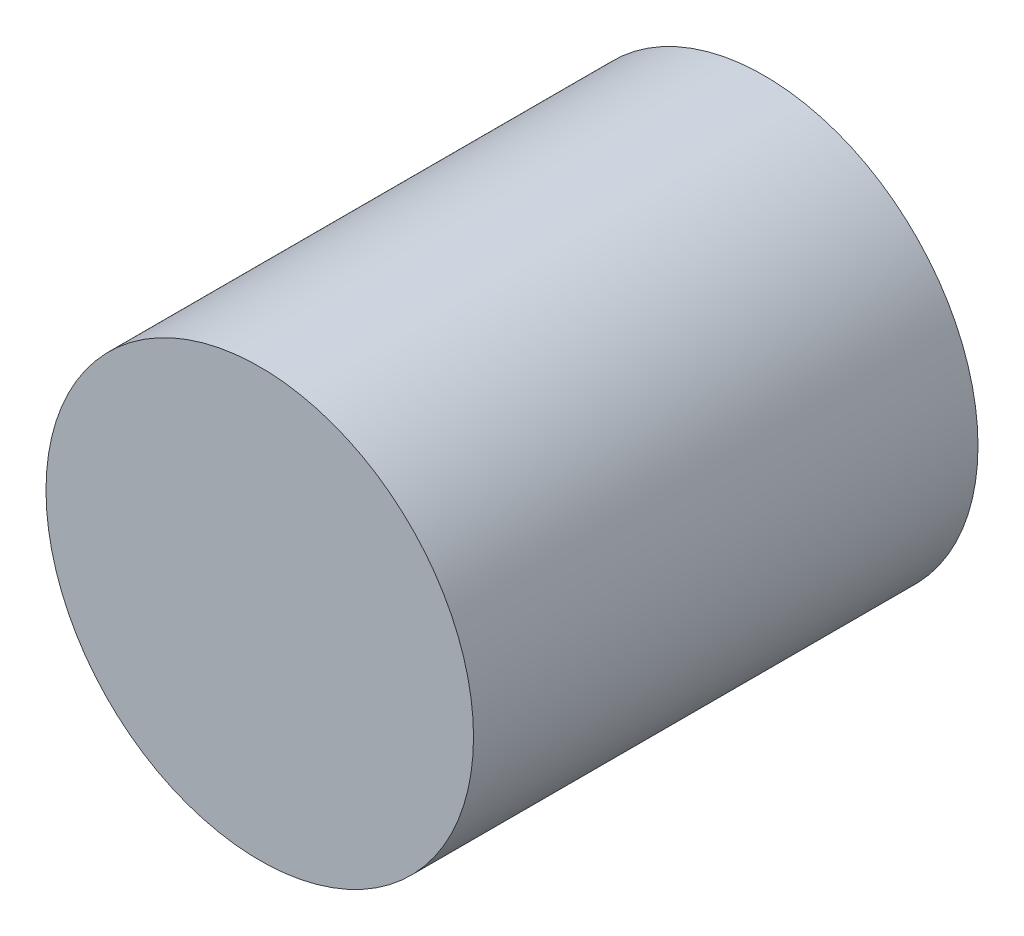
ISO-10303-21;
HEADER;
FILE_DESCRIPTION(('STEP AP214'),'2;1');
FILE_NAME('part.step','',(''),(''),'','','');
FILE_SCHEMA(('AUTOMOTIVE_DESIGN { 1 0 10303 214 1 1 1 1 }'));
ENDSEC;
DATA;
#1=APPLICATION_CONTEXT('core data for automotive mechanical design processes');
#2=APPLICATION_PROTOCOL_DEFINITION('international standard','automotive_design',2000,#1);
#3=PRODUCT_CONTEXT('',#1,'mechanical');
#4=PRODUCT('Part','Part','',(#3));
#5=PRODUCT_RELATED_PRODUCT_CATEGORY('part','',(#4));
#6=PRODUCT_DEFINITION_FORMATION('','',#4);
#7=PRODUCT_DEFINITION_CONTEXT('part definition',#1,'design');
#8=PRODUCT_DEFINITION('design','',#6,#7);
#9=PRODUCT_DEFINITION_SHAPE('','',#8);
#10=(LENGTH_UNIT() NAMED_UNIT(*) SI_UNIT(.MILLI.,.METRE.));
#11=(NAMED_UNIT(*) PLANE_ANGLE_UNIT() SI_UNIT($,.RADIAN.));
#12=(NAMED_UNIT(*) SI_UNIT($,.STERADIAN.) SOLID_ANGLE_UNIT());
#13=UNCERTAINTY_MEASURE_WITH_UNIT(LENGTH_MEASURE(1.E-05),#10,'distance_accuracy_value','');
#14=(GEOMETRIC_REPRESENTATION_CONTEXT(3) GLOBAL_UNCERTAINTY_ASSIGNED_CONTEXT((#13)) GLOBAL_UNIT_ASSIGNED_CONTEXT((#10,
#11,#12)) REPRESENTATION_CONTEXT('',''));
#15=CARTESIAN_POINT('',(0.,0.,0.));
#16=DIRECTION('',(0.,0.,1.));
#17=DIRECTION('',(1.,0.,0.));
#18=AXIS2_PLACEMENT_3D('',#15,#16,#17);
#19=CARTESIAN_POINT('',(0.,0.,59.));
#20=DIRECTION('',(0.,0.,-1.));
#21=DIRECTION('',(-1.,0.,0.));
#22=AXIS2_PLACEMENT_3D('',#19,#20,#21);
#23=CYLINDRICAL_SURFACE('',#22,25.);
#24=CARTESIAN_POINT('',(0.,0.,59.));
#25=DIRECTION('',(0.,0.,1.));
#26=DIRECTION('',(1.,0.,0.));
#27=AXIS2_PLACEMENT_3D('',#24,#25,#26);
#28=CIRCLE('',#27,25.);
#29=CARTESIAN_POINT('',(25.,0.,59.));
#30=VERTEX_POINT('',#29);
#31=EDGE_CURVE('E10',#30,#30,#28,.T.);
#32=ORIENTED_EDGE('',*,*,#31,.F.);
#33=EDGE_LOOP('',(#32));
#34=FACE_BOUND('',#33,.T.);
#35=CARTESIAN_POINT('',(0.,0.,0.));
#36=DIRECTION('',(0.,0.,1.));
#37=DIRECTION('',(1.,0.,0.));
#38=AXIS2_PLACEMENT_3D('',#35,#36,#37);
#39=CIRCLE('',#38,25.);
#40=CARTESIAN_POINT('',(25.,0.,0.));
#41=VERTEX_POINT('',#40);
#42=EDGE_CURVE('E40',#41,#41,#39,.T.);
#43=ORIENTED_EDGE('',*,*,#42,.T.);
#44=EDGE_LOOP('',(#43));
#45=FACE_BOUND('',#44,.T.);
#46=ADVANCED_FACE('F37',(#34,#45),#23,.T.);
#47=CARTESIAN_POINT('',(0.,0.,59.));
#48=DIRECTION('',(0.,0.,1.));
#49=DIRECTION('',(1.,0.,0.));
#50=AXIS2_PLACEMENT_3D('',#47,#48,#49);
#51=PLANE('',#50);
#52=ORIENTED_EDGE('',*,*,#31,.T.);
#53=EDGE_LOOP('',(#52));
#54=FACE_BOUND('',#53,.T.);
#55=ADVANCED_FACE('F54',(#54),#51,.T.);
#56=CARTESIAN_POINT('',(0.,0.,0.));
#57=DIRECTION('',(0.,0.,1.));
#58=DIRECTION('',(1.,0.,0.));
#59=AXIS2_PLACEMENT_3D('',#56,#57,#58);
#60=PLANE('',#59);
#61=ORIENTED_EDGE('',*,*,#42,.F.);
#62=EDGE_LOOP('',(#61));
#63=FACE_BOUND('',#62,.T.);
#64=ADVANCED_FACE('F52',(#63),#60,.F.);
#65=CLOSED_SHELL('',(#46,#55,#64));
#66=MANIFOLD_SOLID_BREP('B2',#65);
#67=ADVANCED_BREP_SHAPE_REPRESENTATION('',(#18,#66),#14);
#68=SHAPE_DEFINITION_REPRESENTATION(#9,#67);
ENDSEC;
END-ISO-10303-21;
